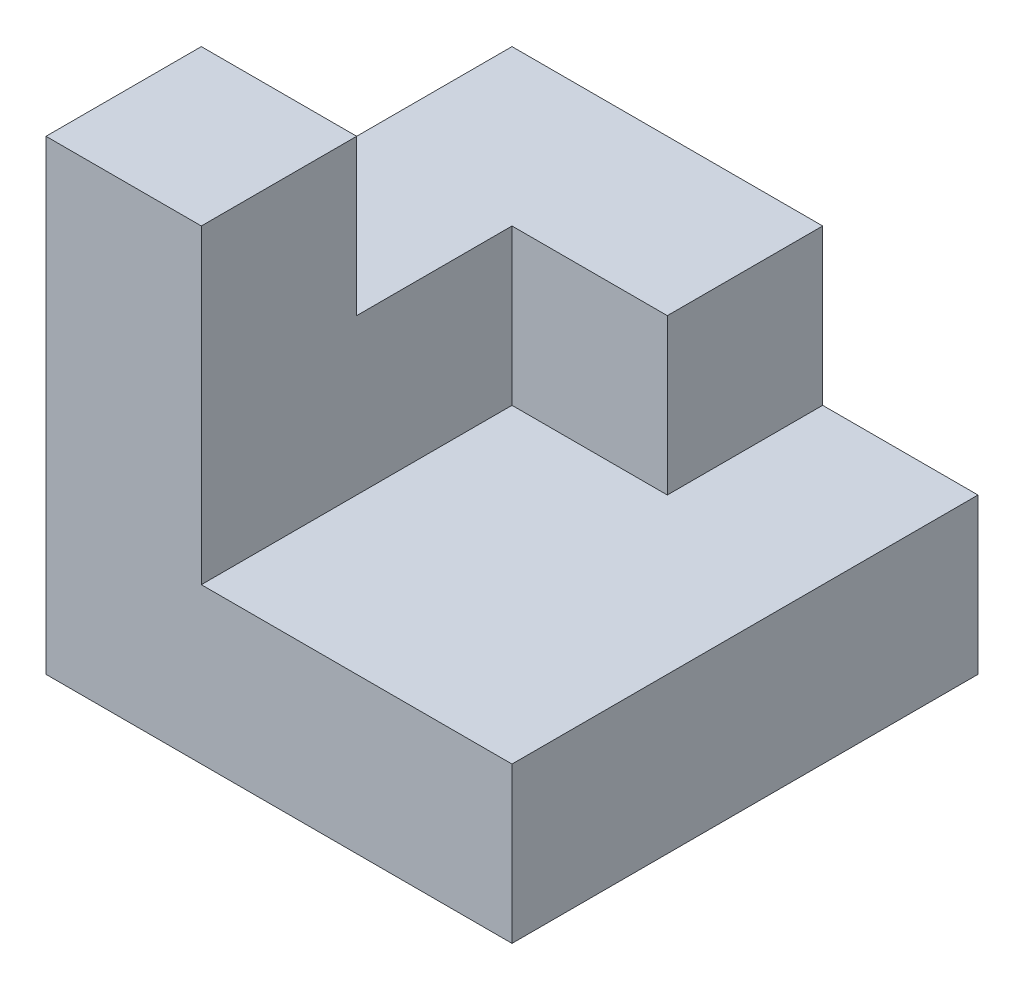
ISO-10303-21;
HEADER;
FILE_DESCRIPTION(('STEP AP214'),'2;1');
FILE_NAME('part.step','',(''),(''),'','','');
FILE_SCHEMA(('AUTOMOTIVE_DESIGN { 1 0 10303 214 1 1 1 1 }'));
ENDSEC;
DATA;
#1=APPLICATION_CONTEXT('core data for automotive mechanical design processes');
#2=APPLICATION_PROTOCOL_DEFINITION('international standard','automotive_design',2000,#1);
#3=PRODUCT_CONTEXT('',#1,'mechanical');
#4=PRODUCT('Part','Part','',(#3));
#5=PRODUCT_RELATED_PRODUCT_CATEGORY('part','',(#4));
#6=PRODUCT_DEFINITION_FORMATION('','',#4);
#7=PRODUCT_DEFINITION_CONTEXT('part definition',#1,'design');
#8=PRODUCT_DEFINITION('design','',#6,#7);
#9=PRODUCT_DEFINITION_SHAPE('','',#8);
#10=(LENGTH_UNIT() NAMED_UNIT(*) SI_UNIT(.MILLI.,.METRE.));
#11=(NAMED_UNIT(*) PLANE_ANGLE_UNIT() SI_UNIT($,.RADIAN.));
#12=(NAMED_UNIT(*) SI_UNIT($,.STERADIAN.) SOLID_ANGLE_UNIT());
#13=UNCERTAINTY_MEASURE_WITH_UNIT(LENGTH_MEASURE(1.E-05),#10,'distance_accuracy_value','');
#14=(GEOMETRIC_REPRESENTATION_CONTEXT(3) GLOBAL_UNCERTAINTY_ASSIGNED_CONTEXT((#13)) GLOBAL_UNIT_ASSIGNED_CONTEXT((#10,
#11,#12)) REPRESENTATION_CONTEXT('',''));
#15=CARTESIAN_POINT('',(0.,0.,0.));
#16=DIRECTION('',(0.,0.,1.));
#17=DIRECTION('',(1.,0.,0.));
#18=AXIS2_PLACEMENT_3D('',#15,#16,#17);
#19=CARTESIAN_POINT('',(30.,20.,-30.));
#20=DIRECTION('',(-1.,0.,0.));
#21=DIRECTION('',(0.,0.,1.));
#22=AXIS2_PLACEMENT_3D('',#19,#20,#21);
#23=PLANE('',#22);
#24=DIRECTION('',(0.,0.,-1.));
#25=VECTOR('',#24,1.);
#26=CARTESIAN_POINT('',(30.,0.,-30.));
#27=LINE('',#26,#25);
#28=CARTESIAN_POINT('',(30.,0.,30.));
#29=VERTEX_POINT('',#28);
#30=CARTESIAN_POINT('',(30.,0.,-30.));
#31=VERTEX_POINT('',#30);
#32=EDGE_CURVE('E179',#29,#31,#27,.T.);
#33=ORIENTED_EDGE('',*,*,#32,.T.);
#34=DIRECTION('',(0.,-1.,0.));
#35=VECTOR('',#34,1.);
#36=CARTESIAN_POINT('',(30.,20.,-30.));
#37=LINE('',#36,#35);
#38=CARTESIAN_POINT('',(30.,20.,-30.));
#39=VERTEX_POINT('',#38);
#40=EDGE_CURVE('E11',#39,#31,#37,.T.);
#41=ORIENTED_EDGE('',*,*,#40,.F.);
#42=DIRECTION('',(0.,0.,-1.));
#43=VECTOR('',#42,1.);
#44=CARTESIAN_POINT('',(30.,20.,-30.));
#45=LINE('',#44,#43);
#46=CARTESIAN_POINT('',(30.,20.,30.));
#47=VERTEX_POINT('',#46);
#48=EDGE_CURVE('E180',#47,#39,#45,.T.);
#49=ORIENTED_EDGE('',*,*,#48,.F.);
#50=DIRECTION('',(0.,-1.,0.));
#51=VECTOR('',#50,1.);
#52=CARTESIAN_POINT('',(30.,20.,30.));
#53=LINE('',#52,#51);
#54=EDGE_CURVE('E126',#47,#29,#53,.T.);
#55=ORIENTED_EDGE('',*,*,#54,.T.);
#56=EDGE_LOOP('',(#33,#41,#49,#55));
#57=FACE_BOUND('',#56,.T.);
#58=ADVANCED_FACE('F39',(#57),#23,.F.);
#59=CARTESIAN_POINT('',(-30.,20.,-30.));
#60=DIRECTION('',(0.,0.,1.));
#61=DIRECTION('',(1.,0.,0.));
#62=AXIS2_PLACEMENT_3D('',#59,#60,#61);
#63=PLANE('',#62);
#64=DIRECTION('',(-1.,0.,0.));
#65=VECTOR('',#64,1.);
#66=CARTESIAN_POINT('',(-30.,0.,-30.));
#67=LINE('',#66,#65);
#68=CARTESIAN_POINT('',(-30.,0.,-30.));
#69=VERTEX_POINT('',#68);
#70=EDGE_CURVE('E190',#31,#69,#67,.T.);
#71=ORIENTED_EDGE('',*,*,#70,.T.);
#72=DIRECTION('',(0.,-1.,0.));
#73=VECTOR('',#72,1.);
#74=CARTESIAN_POINT('',(-30.,20.,-30.));
#75=LINE('',#74,#73);
#76=CARTESIAN_POINT('',(-30.,40.,-30.));
#77=VERTEX_POINT('',#76);
#78=EDGE_CURVE('E46',#77,#69,#75,.T.);
#79=ORIENTED_EDGE('',*,*,#78,.F.);
#80=DIRECTION('',(-1.,0.,0.));
#81=VECTOR('',#80,1.);
#82=CARTESIAN_POINT('',(-30.,40.,-30.));
#83=LINE('',#82,#81);
#84=CARTESIAN_POINT('',(10.,40.,-30.));
#85=VERTEX_POINT('',#84);
#86=EDGE_CURVE('E161',#85,#77,#83,.T.);
#87=ORIENTED_EDGE('',*,*,#86,.F.);
#88=DIRECTION('',(0.,-1.,0.));
#89=VECTOR('',#88,1.);
#90=CARTESIAN_POINT('',(10.,40.,-30.));
#91=LINE('',#90,#89);
#92=CARTESIAN_POINT('',(10.,20.,-30.));
#93=VERTEX_POINT('',#92);
#94=EDGE_CURVE('E164',#85,#93,#91,.T.);
#95=ORIENTED_EDGE('',*,*,#94,.T.);
#96=DIRECTION('',(-1.,0.,0.));
#97=VECTOR('',#96,1.);
#98=CARTESIAN_POINT('',(-30.,20.,-30.));
#99=LINE('',#98,#97);
#100=EDGE_CURVE('E183',#39,#93,#99,.T.);
#101=ORIENTED_EDGE('',*,*,#100,.F.);
#102=ORIENTED_EDGE('',*,*,#40,.T.);
#103=EDGE_LOOP('',(#71,#79,#87,#95,#101,#102));
#104=FACE_BOUND('',#103,.T.);
#105=ADVANCED_FACE('F223',(#104),#63,.F.);
#106=CARTESIAN_POINT('',(-30.,20.,-30.));
#107=DIRECTION('',(1.,0.,0.));
#108=DIRECTION('',(0.,0.,-1.));
#109=AXIS2_PLACEMENT_3D('',#106,#107,#108);
#110=PLANE('',#109);
#111=DIRECTION('',(0.,0.,1.));
#112=VECTOR('',#111,1.);
#113=CARTESIAN_POINT('',(-30.,0.,-30.));
#114=LINE('',#113,#112);
#115=CARTESIAN_POINT('',(-30.,0.,30.));
#116=VERTEX_POINT('',#115);
#117=EDGE_CURVE('E123',#69,#116,#114,.T.);
#118=ORIENTED_EDGE('',*,*,#117,.T.);
#119=DIRECTION('',(0.,-1.,0.));
#120=VECTOR('',#119,1.);
#121=CARTESIAN_POINT('',(-30.,20.,30.));
#122=LINE('',#121,#120);
#123=CARTESIAN_POINT('',(-30.,60.,30.));
#124=VERTEX_POINT('',#123);
#125=EDGE_CURVE('E115',#124,#116,#122,.T.);
#126=ORIENTED_EDGE('',*,*,#125,.F.);
#127=DIRECTION('',(0.,0.,1.));
#128=VECTOR('',#127,1.);
#129=CARTESIAN_POINT('',(-30.,60.,30.));
#130=LINE('',#129,#128);
#131=CARTESIAN_POINT('',(-30.,60.,9.99999999999998));
#132=VERTEX_POINT('',#131);
#133=EDGE_CURVE('E120',#132,#124,#130,.T.);
#134=ORIENTED_EDGE('',*,*,#133,.F.);
#135=DIRECTION('',(0.,-1.,0.));
#136=VECTOR('',#135,1.);
#137=CARTESIAN_POINT('',(-30.,60.,9.99999999999998));
#138=LINE('',#137,#136);
#139=CARTESIAN_POINT('',(-30.,40.,9.99999999999998));
#140=VERTEX_POINT('',#139);
#141=EDGE_CURVE('E146',#132,#140,#138,.T.);
#142=ORIENTED_EDGE('',*,*,#141,.T.);
#143=DIRECTION('',(0.,0.,1.));
#144=VECTOR('',#143,1.);
#145=CARTESIAN_POINT('',(-30.,40.,-30.));
#146=LINE('',#145,#144);
#147=EDGE_CURVE('E153',#77,#140,#146,.T.);
#148=ORIENTED_EDGE('',*,*,#147,.F.);
#149=ORIENTED_EDGE('',*,*,#78,.T.);
#150=EDGE_LOOP('',(#118,#126,#134,#142,#148,#149));
#151=FACE_BOUND('',#150,.T.);
#152=ADVANCED_FACE('F117',(#151),#110,.F.);
#153=CARTESIAN_POINT('',(-30.,20.,30.));
#154=DIRECTION('',(0.,0.,-1.));
#155=DIRECTION('',(-1.,0.,0.));
#156=AXIS2_PLACEMENT_3D('',#153,#154,#155);
#157=PLANE('',#156);
#158=DIRECTION('',(1.,0.,0.));
#159=VECTOR('',#158,1.);
#160=CARTESIAN_POINT('',(-30.,0.,30.));
#161=LINE('',#160,#159);
#162=EDGE_CURVE('E184',#116,#29,#161,.T.);
#163=ORIENTED_EDGE('',*,*,#162,.T.);
#164=ORIENTED_EDGE('',*,*,#54,.F.);
#165=DIRECTION('',(1.,0.,0.));
#166=VECTOR('',#165,1.);
#167=CARTESIAN_POINT('',(-30.,20.,30.));
#168=LINE('',#167,#166);
#169=CARTESIAN_POINT('',(-10.,20.,30.));
#170=VERTEX_POINT('',#169);
#171=EDGE_CURVE('E186',#170,#47,#168,.T.);
#172=ORIENTED_EDGE('',*,*,#171,.F.);
#173=DIRECTION('',(0.,-1.,0.));
#174=VECTOR('',#173,1.);
#175=CARTESIAN_POINT('',(-10.,40.,30.));
#176=LINE('',#175,#174);
#177=CARTESIAN_POINT('',(-10.,60.,30.));
#178=VERTEX_POINT('',#177);
#179=EDGE_CURVE('E133',#178,#170,#176,.T.);
#180=ORIENTED_EDGE('',*,*,#179,.F.);
#181=DIRECTION('',(1.,0.,0.));
#182=VECTOR('',#181,1.);
#183=CARTESIAN_POINT('',(-30.,60.,30.));
#184=LINE('',#183,#182);
#185=EDGE_CURVE('E129',#124,#178,#184,.T.);
#186=ORIENTED_EDGE('',*,*,#185,.F.);
#187=ORIENTED_EDGE('',*,*,#125,.T.);
#188=EDGE_LOOP('',(#163,#164,#172,#180,#186,#187));
#189=FACE_BOUND('',#188,.T.);
#190=ADVANCED_FACE('F130',(#189),#157,.F.);
#191=CARTESIAN_POINT('',(0.,20.,0.));
#192=DIRECTION('',(0.,1.,0.));
#193=DIRECTION('',(0.,0.,1.));
#194=AXIS2_PLACEMENT_3D('',#191,#192,#193);
#195=PLANE('',#194);
#196=DIRECTION('',(0.,0.,-1.));
#197=VECTOR('',#196,1.);
#198=CARTESIAN_POINT('',(10.,20.,-10.));
#199=LINE('',#198,#197);
#200=CARTESIAN_POINT('',(10.,20.,-10.));
#201=VERTEX_POINT('',#200);
#202=EDGE_CURVE('E61',#201,#93,#199,.T.);
#203=ORIENTED_EDGE('',*,*,#202,.F.);
#204=DIRECTION('',(1.,0.,0.));
#205=VECTOR('',#204,1.);
#206=CARTESIAN_POINT('',(-10.,20.,-10.));
#207=LINE('',#206,#205);
#208=CARTESIAN_POINT('',(-10.,20.,-10.));
#209=VERTEX_POINT('',#208);
#210=EDGE_CURVE('E167',#209,#201,#207,.T.);
#211=ORIENTED_EDGE('',*,*,#210,.F.);
#212=DIRECTION('',(0.,0.,-1.));
#213=VECTOR('',#212,1.);
#214=CARTESIAN_POINT('',(-10.,20.,30.));
#215=LINE('',#214,#213);
#216=EDGE_CURVE('E152',#170,#209,#215,.T.);
#217=ORIENTED_EDGE('',*,*,#216,.F.);
#218=ORIENTED_EDGE('',*,*,#171,.T.);
#219=ORIENTED_EDGE('',*,*,#48,.T.);
#220=ORIENTED_EDGE('',*,*,#100,.T.);
#221=EDGE_LOOP('',(#203,#211,#217,#218,#219,#220));
#222=FACE_BOUND('',#221,.T.);
#223=ADVANCED_FACE('F205',(#222),#195,.T.);
#224=CARTESIAN_POINT('',(0.,0.,0.));
#225=DIRECTION('',(0.,1.,0.));
#226=DIRECTION('',(0.,0.,1.));
#227=AXIS2_PLACEMENT_3D('',#224,#225,#226);
#228=PLANE('',#227);
#229=ORIENTED_EDGE('',*,*,#32,.F.);
#230=ORIENTED_EDGE('',*,*,#162,.F.);
#231=ORIENTED_EDGE('',*,*,#117,.F.);
#232=ORIENTED_EDGE('',*,*,#70,.F.);
#233=EDGE_LOOP('',(#229,#230,#231,#232));
#234=FACE_BOUND('',#233,.T.);
#235=ADVANCED_FACE('F200',(#234),#228,.F.);
#236=CARTESIAN_POINT('',(-10.,40.,30.));
#237=DIRECTION('',(-1.,0.,0.));
#238=DIRECTION('',(0.,0.,1.));
#239=AXIS2_PLACEMENT_3D('',#236,#237,#238);
#240=PLANE('',#239);
#241=ORIENTED_EDGE('',*,*,#216,.T.);
#242=DIRECTION('',(0.,-1.,0.));
#243=VECTOR('',#242,1.);
#244=CARTESIAN_POINT('',(-10.,40.,-10.));
#245=LINE('',#244,#243);
#246=CARTESIAN_POINT('',(-10.,40.,-10.));
#247=VERTEX_POINT('',#246);
#248=EDGE_CURVE('E175',#247,#209,#245,.T.);
#249=ORIENTED_EDGE('',*,*,#248,.F.);
#250=DIRECTION('',(0.,0.,-1.));
#251=VECTOR('',#250,1.);
#252=CARTESIAN_POINT('',(-10.,40.,30.));
#253=LINE('',#252,#251);
#254=CARTESIAN_POINT('',(-10.,40.,9.99999999999998));
#255=VERTEX_POINT('',#254);
#256=EDGE_CURVE('E155',#255,#247,#253,.T.);
#257=ORIENTED_EDGE('',*,*,#256,.F.);
#258=DIRECTION('',(0.,-1.,0.));
#259=VECTOR('',#258,1.);
#260=CARTESIAN_POINT('',(-10.,60.,9.99999999999998));
#261=LINE('',#260,#259);
#262=CARTESIAN_POINT('',(-10.,60.,9.99999999999998));
#263=VERTEX_POINT('',#262);
#264=EDGE_CURVE('E149',#263,#255,#261,.T.);
#265=ORIENTED_EDGE('',*,*,#264,.F.);
#266=DIRECTION('',(0.,0.,-1.));
#267=VECTOR('',#266,1.);
#268=CARTESIAN_POINT('',(-10.,60.,30.));
#269=LINE('',#268,#267);
#270=EDGE_CURVE('E136',#178,#263,#269,.T.);
#271=ORIENTED_EDGE('',*,*,#270,.F.);
#272=ORIENTED_EDGE('',*,*,#179,.T.);
#273=EDGE_LOOP('',(#241,#249,#257,#265,#271,#272));
#274=FACE_BOUND('',#273,.T.);
#275=ADVANCED_FACE('F207',(#274),#240,.F.);
#276=CARTESIAN_POINT('',(-10.,40.,-10.));
#277=DIRECTION('',(0.,0.,-1.));
#278=DIRECTION('',(-1.,0.,0.));
#279=AXIS2_PLACEMENT_3D('',#276,#277,#278);
#280=PLANE('',#279);
#281=ORIENTED_EDGE('',*,*,#210,.T.);
#282=DIRECTION('',(0.,-1.,0.));
#283=VECTOR('',#282,1.);
#284=CARTESIAN_POINT('',(10.,40.,-10.));
#285=LINE('',#284,#283);
#286=CARTESIAN_POINT('',(10.,40.,-10.));
#287=VERTEX_POINT('',#286);
#288=EDGE_CURVE('E172',#287,#201,#285,.T.);
#289=ORIENTED_EDGE('',*,*,#288,.F.);
#290=DIRECTION('',(1.,0.,0.));
#291=VECTOR('',#290,1.);
#292=CARTESIAN_POINT('',(-10.,40.,-10.));
#293=LINE('',#292,#291);
#294=EDGE_CURVE('E157',#247,#287,#293,.T.);
#295=ORIENTED_EDGE('',*,*,#294,.F.);
#296=ORIENTED_EDGE('',*,*,#248,.T.);
#297=EDGE_LOOP('',(#281,#289,#295,#296));
#298=FACE_BOUND('',#297,.T.);
#299=ADVANCED_FACE('F240',(#298),#280,.F.);
#300=CARTESIAN_POINT('',(10.,40.,-10.));
#301=DIRECTION('',(-1.,0.,0.));
#302=DIRECTION('',(0.,0.,1.));
#303=AXIS2_PLACEMENT_3D('',#300,#301,#302);
#304=PLANE('',#303);
#305=ORIENTED_EDGE('',*,*,#202,.T.);
#306=ORIENTED_EDGE('',*,*,#94,.F.);
#307=DIRECTION('',(0.,0.,-1.));
#308=VECTOR('',#307,1.);
#309=CARTESIAN_POINT('',(10.,40.,-10.));
#310=LINE('',#309,#308);
#311=EDGE_CURVE('E159',#287,#85,#310,.T.);
#312=ORIENTED_EDGE('',*,*,#311,.F.);
#313=ORIENTED_EDGE('',*,*,#288,.T.);
#314=EDGE_LOOP('',(#305,#306,#312,#313));
#315=FACE_BOUND('',#314,.T.);
#316=ADVANCED_FACE('F220',(#315),#304,.F.);
#317=CARTESIAN_POINT('',(0.,40.,0.));
#318=DIRECTION('',(0.,1.,0.));
#319=DIRECTION('',(0.,0.,1.));
#320=AXIS2_PLACEMENT_3D('',#317,#318,#319);
#321=PLANE('',#320);
#322=DIRECTION('',(-1.,0.,0.));
#323=VECTOR('',#322,1.);
#324=CARTESIAN_POINT('',(-30.,40.,9.99999999999998));
#325=LINE('',#324,#323);
#326=EDGE_CURVE('E53',#255,#140,#325,.T.);
#327=ORIENTED_EDGE('',*,*,#326,.F.);
#328=ORIENTED_EDGE('',*,*,#256,.T.);
#329=ORIENTED_EDGE('',*,*,#294,.T.);
#330=ORIENTED_EDGE('',*,*,#311,.T.);
#331=ORIENTED_EDGE('',*,*,#86,.T.);
#332=ORIENTED_EDGE('',*,*,#147,.T.);
#333=EDGE_LOOP('',(#327,#328,#329,#330,#331,#332));
#334=FACE_BOUND('',#333,.T.);
#335=ADVANCED_FACE('F213',(#334),#321,.T.);
#336=CARTESIAN_POINT('',(-30.,60.,9.99999999999998));
#337=DIRECTION('',(0.,0.,1.));
#338=DIRECTION('',(1.,0.,0.));
#339=AXIS2_PLACEMENT_3D('',#336,#337,#338);
#340=PLANE('',#339);
#341=ORIENTED_EDGE('',*,*,#326,.T.);
#342=ORIENTED_EDGE('',*,*,#141,.F.);
#343=DIRECTION('',(-1.,0.,0.));
#344=VECTOR('',#343,1.);
#345=CARTESIAN_POINT('',(-30.,60.,9.99999999999998));
#346=LINE('',#345,#344);
#347=EDGE_CURVE('E140',#263,#132,#346,.T.);
#348=ORIENTED_EDGE('',*,*,#347,.F.);
#349=ORIENTED_EDGE('',*,*,#264,.T.);
#350=EDGE_LOOP('',(#341,#342,#348,#349));
#351=FACE_BOUND('',#350,.T.);
#352=ADVANCED_FACE('F211',(#351),#340,.F.);
#353=CARTESIAN_POINT('',(0.,60.,0.));
#354=DIRECTION('',(0.,-1.,0.));
#355=DIRECTION('',(0.,0.,-1.));
#356=AXIS2_PLACEMENT_3D('',#353,#354,#355);
#357=PLANE('',#356);
#358=ORIENTED_EDGE('',*,*,#133,.T.);
#359=ORIENTED_EDGE('',*,*,#185,.T.);
#360=ORIENTED_EDGE('',*,*,#270,.T.);
#361=ORIENTED_EDGE('',*,*,#347,.T.);
#362=EDGE_LOOP('',(#358,#359,#360,#361));
#363=FACE_BOUND('',#362,.T.);
#364=ADVANCED_FACE('F138',(#363),#357,.F.);
#365=CLOSED_SHELL('',(#58,#105,#152,#190,#223,#235,#275,#299,#316,#335,#352,#364));
#366=MANIFOLD_SOLID_BREP('B2',#365);
#367=ADVANCED_BREP_SHAPE_REPRESENTATION('',(#18,#366),#14);
#368=SHAPE_DEFINITION_REPRESENTATION(#9,#367);
ENDSEC;
END-ISO-10303-21;
